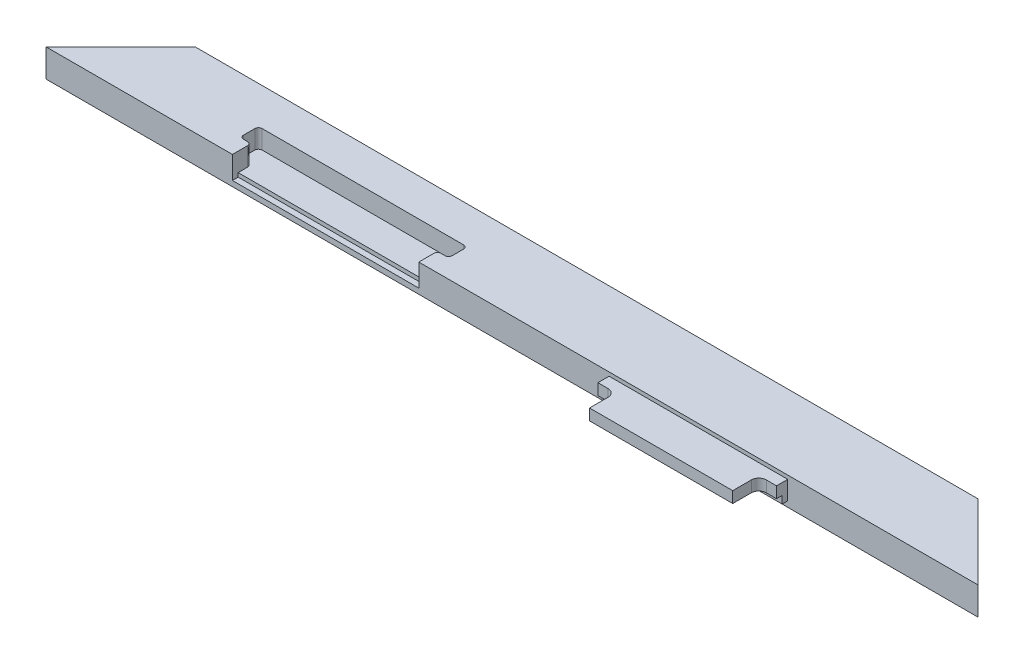
ISO-10303-21;
HEADER;
FILE_DESCRIPTION(('STEP AP214'),'2;1');
FILE_NAME('part.step','',(''),(''),'','','');
FILE_SCHEMA(('AUTOMOTIVE_DESIGN { 1 0 10303 214 1 1 1 1 }'));
ENDSEC;
DATA;
#1=APPLICATION_CONTEXT('core data for automotive mechanical design processes');
#2=APPLICATION_PROTOCOL_DEFINITION('international standard','automotive_design',2000,#1);
#3=PRODUCT_CONTEXT('',#1,'mechanical');
#4=PRODUCT('Part','Part','',(#3));
#5=PRODUCT_RELATED_PRODUCT_CATEGORY('part','',(#4));
#6=PRODUCT_DEFINITION_FORMATION('','',#4);
#7=PRODUCT_DEFINITION_CONTEXT('part definition',#1,'design');
#8=PRODUCT_DEFINITION('design','',#6,#7);
#9=PRODUCT_DEFINITION_SHAPE('','',#8);
#10=(LENGTH_UNIT() NAMED_UNIT(*) SI_UNIT(.MILLI.,.METRE.));
#11=(NAMED_UNIT(*) PLANE_ANGLE_UNIT() SI_UNIT($,.RADIAN.));
#12=(NAMED_UNIT(*) SI_UNIT($,.STERADIAN.) SOLID_ANGLE_UNIT());
#13=UNCERTAINTY_MEASURE_WITH_UNIT(LENGTH_MEASURE(1.E-05),#10,'distance_accuracy_value','');
#14=(GEOMETRIC_REPRESENTATION_CONTEXT(3) GLOBAL_UNCERTAINTY_ASSIGNED_CONTEXT((#13)) GLOBAL_UNIT_ASSIGNED_CONTEXT((#10,
#11,#12)) REPRESENTATION_CONTEXT('',''));
#15=CARTESIAN_POINT('',(0.,0.,0.));
#16=DIRECTION('',(0.,0.,1.));
#17=DIRECTION('',(1.,0.,0.));
#18=AXIS2_PLACEMENT_3D('',#15,#16,#17);
#19=CARTESIAN_POINT('',(-125.,3.75,10.));
#20=DIRECTION('',(0.,0.,-1.));
#21=DIRECTION('',(-1.,0.,0.));
#22=AXIS2_PLACEMENT_3D('',#19,#20,#21);
#23=PLANE('',#22);
#24=DIRECTION('',(1.,0.,0.));
#25=VECTOR('',#24,1.);
#26=CARTESIAN_POINT('',(26.0437500000001,-2.25,10.));
#27=LINE('',#26,#25);
#28=CARTESIAN_POINT('',(26.0437500000001,-2.25,10.));
#29=VERTEX_POINT('',#28);
#30=CARTESIAN_POINT('',(73.9562500000001,-2.25,10.));
#31=VERTEX_POINT('',#30);
#32=EDGE_CURVE('E333',#29,#31,#27,.T.);
#33=ORIENTED_EDGE('',*,*,#32,.F.);
#34=DIRECTION('',(0.,1.,0.));
#35=VECTOR('',#34,1.);
#36=CARTESIAN_POINT('',(26.0437500000001,-0.25,10.));
#37=LINE('',#36,#35);
#38=CARTESIAN_POINT('',(26.0437500000001,2.75,10.));
#39=VERTEX_POINT('',#38);
#40=EDGE_CURVE('E368',#29,#39,#37,.T.);
#41=ORIENTED_EDGE('',*,*,#40,.T.);
#42=DIRECTION('',(-1.,0.,0.));
#43=VECTOR('',#42,1.);
#44=CARTESIAN_POINT('',(73.9562500000001,2.75,10.));
#45=LINE('',#44,#43);
#46=CARTESIAN_POINT('',(73.9562500000001,2.75,10.));
#47=VERTEX_POINT('',#46);
#48=EDGE_CURVE('E348',#47,#39,#45,.T.);
#49=ORIENTED_EDGE('',*,*,#48,.F.);
#50=DIRECTION('',(0.,1.,0.));
#51=VECTOR('',#50,1.);
#52=CARTESIAN_POINT('',(73.9562500000001,-0.25,10.));
#53=LINE('',#52,#51);
#54=EDGE_CURVE('E388',#31,#47,#53,.T.);
#55=ORIENTED_EDGE('',*,*,#54,.F.);
#56=EDGE_LOOP('',(#33,#41,#49,#55));
#57=FACE_BOUND('',#56,.T.);
#58=DIRECTION('',(0.,-1.,0.));
#59=VECTOR('',#58,1.);
#60=CARTESIAN_POINT('',(-24.9999999999999,3.75,9.99999999999999));
#61=LINE('',#60,#59);
#62=CARTESIAN_POINT('',(-24.9999999999999,3.75,9.99999999999999));
#63=VERTEX_POINT('',#62);
#64=CARTESIAN_POINT('',(-24.9999999999999,-2.3,9.99999999999999));
#65=VERTEX_POINT('',#64);
#66=EDGE_CURVE('E325',#63,#65,#61,.T.);
#67=ORIENTED_EDGE('',*,*,#66,.T.);
#68=DIRECTION('',(-1.,0.,0.));
#69=VECTOR('',#68,1.);
#70=CARTESIAN_POINT('',(-24.9999999999999,-2.3,9.99999999999999));
#71=LINE('',#70,#69);
#72=CARTESIAN_POINT('',(-74.9999999999999,-2.3,9.99999999999999));
#73=VERTEX_POINT('',#72);
#74=EDGE_CURVE('E267',#65,#73,#71,.T.);
#75=ORIENTED_EDGE('',*,*,#74,.T.);
#76=DIRECTION('',(0.,-1.,0.));
#77=VECTOR('',#76,1.);
#78=CARTESIAN_POINT('',(-74.9999999999999,3.75,9.99999999999999));
#79=LINE('',#78,#77);
#80=CARTESIAN_POINT('',(-74.9999999999999,3.75,9.99999999999999));
#81=VERTEX_POINT('',#80);
#82=EDGE_CURVE('E326',#81,#73,#79,.T.);
#83=ORIENTED_EDGE('',*,*,#82,.F.);
#84=DIRECTION('',(1.,0.,0.));
#85=VECTOR('',#84,1.);
#86=CARTESIAN_POINT('',(-125.,3.75,10.));
#87=LINE('',#86,#85);
#88=CARTESIAN_POINT('',(-125.,3.75,10.));
#89=VERTEX_POINT('',#88);
#90=EDGE_CURVE('E409',#89,#81,#87,.T.);
#91=ORIENTED_EDGE('',*,*,#90,.F.);
#92=DIRECTION('',(0.,-1.,0.));
#93=VECTOR('',#92,1.);
#94=CARTESIAN_POINT('',(-125.,3.75,10.));
#95=LINE('',#94,#93);
#96=CARTESIAN_POINT('',(-125.,-3.75,10.));
#97=VERTEX_POINT('',#96);
#98=EDGE_CURVE('E428',#89,#97,#95,.T.);
#99=ORIENTED_EDGE('',*,*,#98,.T.);
#100=DIRECTION('',(1.,0.,0.));
#101=VECTOR('',#100,1.);
#102=CARTESIAN_POINT('',(-125.,-3.75,10.));
#103=LINE('',#102,#101);
#104=CARTESIAN_POINT('',(125.,-3.75,10.));
#105=VERTEX_POINT('',#104);
#106=EDGE_CURVE('E418',#97,#105,#103,.T.);
#107=ORIENTED_EDGE('',*,*,#106,.T.);
#108=DIRECTION('',(0.,-1.,0.));
#109=VECTOR('',#108,1.);
#110=CARTESIAN_POINT('',(125.,3.75,10.));
#111=LINE('',#110,#109);
#112=CARTESIAN_POINT('',(125.,3.75,10.));
#113=VERTEX_POINT('',#112);
#114=EDGE_CURVE('E425',#113,#105,#111,.T.);
#115=ORIENTED_EDGE('',*,*,#114,.F.);
#116=EDGE_CURVE('E407',#63,#113,#87,.T.);
#117=ORIENTED_EDGE('',*,*,#116,.F.);
#118=EDGE_LOOP('',(#67,#75,#83,#91,#99,#107,#115,#117));
#119=FACE_BOUND('',#118,.T.);
#120=ADVANCED_FACE('F39',(#57,#119),#23,.F.);
#121=CARTESIAN_POINT('',(0.,3.75,0.));
#122=DIRECTION('',(0.,1.,0.));
#123=DIRECTION('',(0.,0.,1.));
#124=AXIS2_PLACEMENT_3D('',#121,#122,#123);
#125=PLANE('',#124);
#126=DIRECTION('',(-1.,0.,0.));
#127=VECTOR('',#126,1.);
#128=CARTESIAN_POINT('',(0.,3.75,5.));
#129=LINE('',#128,#127);
#130=CARTESIAN_POINT('',(-22.9999999999999,3.75,5.));
#131=VERTEX_POINT('',#130);
#132=CARTESIAN_POINT('',(-23.9999999999999,3.75,5.));
#133=VERTEX_POINT('',#132);
#134=EDGE_CURVE('E312',#131,#133,#129,.T.);
#135=ORIENTED_EDGE('',*,*,#134,.T.);
#136=CARTESIAN_POINT('',(-23.9999999999999,3.75,6.));
#137=DIRECTION('',(0.,1.,0.));
#138=DIRECTION('',(0.,0.,1.));
#139=AXIS2_PLACEMENT_3D('',#136,#137,#138);
#140=CIRCLE('',#139,1.);
#141=CARTESIAN_POINT('',(-24.9999999999999,3.75,6.));
#142=VERTEX_POINT('',#141);
#143=EDGE_CURVE('E476',#133,#142,#140,.T.);
#144=ORIENTED_EDGE('',*,*,#143,.T.);
#145=DIRECTION('',(0.,0.,1.));
#146=VECTOR('',#145,1.);
#147=CARTESIAN_POINT('',(-24.9999999999999,3.75,0.));
#148=LINE('',#147,#146);
#149=EDGE_CURVE('E315',#142,#63,#148,.T.);
#150=ORIENTED_EDGE('',*,*,#149,.T.);
#151=ORIENTED_EDGE('',*,*,#116,.T.);
#152=DIRECTION('',(-0.707106781186552,0.,-0.707106781186544));
#153=VECTOR('',#152,1.);
#154=CARTESIAN_POINT('',(125.,3.75,10.));
#155=LINE('',#154,#153);
#156=CARTESIAN_POINT('',(105.,3.75,-10.));
#157=VERTEX_POINT('',#156);
#158=EDGE_CURVE('E412',#113,#157,#155,.T.);
#159=ORIENTED_EDGE('',*,*,#158,.T.);
#160=DIRECTION('',(-1.,0.,0.));
#161=VECTOR('',#160,1.);
#162=CARTESIAN_POINT('',(-105.,3.75,-10.));
#163=LINE('',#162,#161);
#164=CARTESIAN_POINT('',(-105.,3.75,-10.));
#165=VERTEX_POINT('',#164);
#166=EDGE_CURVE('E414',#157,#165,#163,.T.);
#167=ORIENTED_EDGE('',*,*,#166,.T.);
#168=DIRECTION('',(-0.707106781186546,0.,0.707106781186549));
#169=VECTOR('',#168,1.);
#170=CARTESIAN_POINT('',(-125.,3.75,10.));
#171=LINE('',#170,#169);
#172=EDGE_CURVE('E404',#165,#89,#171,.T.);
#173=ORIENTED_EDGE('',*,*,#172,.T.);
#174=ORIENTED_EDGE('',*,*,#90,.T.);
#175=DIRECTION('',(0.,0.,1.));
#176=VECTOR('',#175,1.);
#177=CARTESIAN_POINT('',(-74.9999999999999,3.75,0.));
#178=LINE('',#177,#176);
#179=CARTESIAN_POINT('',(-74.9999999999999,3.75,6.));
#180=VERTEX_POINT('',#179);
#181=EDGE_CURVE('E317',#180,#81,#178,.T.);
#182=ORIENTED_EDGE('',*,*,#181,.F.);
#183=CARTESIAN_POINT('',(-75.9999999999999,3.75,6.));
#184=DIRECTION('',(0.,1.,0.));
#185=DIRECTION('',(0.,0.,1.));
#186=AXIS2_PLACEMENT_3D('',#183,#184,#185);
#187=CIRCLE('',#186,1.);
#188=CARTESIAN_POINT('',(-75.9999999999999,3.75,5.));
#189=VERTEX_POINT('',#188);
#190=EDGE_CURVE('E474',#180,#189,#187,.T.);
#191=ORIENTED_EDGE('',*,*,#190,.T.);
#192=DIRECTION('',(1.,0.,0.));
#193=VECTOR('',#192,1.);
#194=CARTESIAN_POINT('',(0.,3.75,5.));
#195=LINE('',#194,#193);
#196=CARTESIAN_POINT('',(-76.9999999999999,3.75,5.));
#197=VERTEX_POINT('',#196);
#198=EDGE_CURVE('E319',#197,#189,#195,.T.);
#199=ORIENTED_EDGE('',*,*,#198,.F.);
#200=CARTESIAN_POINT('',(-76.9999999999999,3.75,4.));
#201=DIRECTION('',(0.,1.,0.));
#202=DIRECTION('',(0.,0.,1.));
#203=AXIS2_PLACEMENT_3D('',#200,#201,#202);
#204=CIRCLE('',#203,1.);
#205=CARTESIAN_POINT('',(-77.9999999999999,3.75,4.));
#206=VERTEX_POINT('',#205);
#207=EDGE_CURVE('E496',#197,#206,#204,.F.);
#208=ORIENTED_EDGE('',*,*,#207,.T.);
#209=DIRECTION('',(0.,0.,1.));
#210=VECTOR('',#209,1.);
#211=CARTESIAN_POINT('',(-77.9999999999999,3.75,0.));
#212=LINE('',#211,#210);
#213=CARTESIAN_POINT('',(-77.9999999999999,3.75,1.00000000000001));
#214=VERTEX_POINT('',#213);
#215=EDGE_CURVE('E322',#214,#206,#212,.T.);
#216=ORIENTED_EDGE('',*,*,#215,.F.);
#217=CARTESIAN_POINT('',(-76.9999999999999,3.75,1.00000000000001));
#218=DIRECTION('',(0.,1.,0.));
#219=DIRECTION('',(0.,0.,1.));
#220=AXIS2_PLACEMENT_3D('',#217,#218,#219);
#221=CIRCLE('',#220,1.);
#222=CARTESIAN_POINT('',(-76.9999999999999,3.75,0.));
#223=VERTEX_POINT('',#222);
#224=EDGE_CURVE('E498',#214,#223,#221,.F.);
#225=ORIENTED_EDGE('',*,*,#224,.T.);
#226=DIRECTION('',(-1.,0.,0.));
#227=VECTOR('',#226,1.);
#228=CARTESIAN_POINT('',(0.,3.75,0.));
#229=LINE('',#228,#227);
#230=CARTESIAN_POINT('',(-22.9999999999999,3.75,0.));
#231=VERTEX_POINT('',#230);
#232=EDGE_CURVE('E306',#231,#223,#229,.T.);
#233=ORIENTED_EDGE('',*,*,#232,.F.);
#234=CARTESIAN_POINT('',(-22.9999999999999,3.75,1.));
#235=DIRECTION('',(0.,1.,0.));
#236=DIRECTION('',(0.,0.,1.));
#237=AXIS2_PLACEMENT_3D('',#234,#235,#236);
#238=CIRCLE('',#237,1.);
#239=CARTESIAN_POINT('',(-21.9999999999999,3.75,1.));
#240=VERTEX_POINT('',#239);
#241=EDGE_CURVE('E490',#231,#240,#238,.F.);
#242=ORIENTED_EDGE('',*,*,#241,.T.);
#243=DIRECTION('',(0.,0.,1.));
#244=VECTOR('',#243,1.);
#245=CARTESIAN_POINT('',(-21.9999999999999,3.75,0.));
#246=LINE('',#245,#244);
#247=CARTESIAN_POINT('',(-21.9999999999999,3.75,4.));
#248=VERTEX_POINT('',#247);
#249=EDGE_CURVE('E309',#240,#248,#246,.T.);
#250=ORIENTED_EDGE('',*,*,#249,.T.);
#251=CARTESIAN_POINT('',(-22.9999999999999,3.75,4.));
#252=DIRECTION('',(0.,1.,0.));
#253=DIRECTION('',(0.,0.,1.));
#254=AXIS2_PLACEMENT_3D('',#251,#252,#253);
#255=CIRCLE('',#254,1.);
#256=EDGE_CURVE('E492',#248,#131,#255,.F.);
#257=ORIENTED_EDGE('',*,*,#256,.T.);
#258=EDGE_LOOP('',(#135,#144,#150,#151,#159,#167,#173,#174,#182,#191,#199,#208,#216,#225,#233,
#242,#250,#257));
#259=FACE_BOUND('',#258,.T.);
#260=ADVANCED_FACE('F517',(#259),#125,.T.);
#261=CARTESIAN_POINT('',(0.,-0.25,0.));
#262=DIRECTION('',(0.,1.,0.));
#263=DIRECTION('',(0.,0.,1.));
#264=AXIS2_PLACEMENT_3D('',#261,#262,#263);
#265=PLANE('',#264);
#266=DIRECTION('',(-1.,0.,0.));
#267=VECTOR('',#266,1.);
#268=CARTESIAN_POINT('',(26.0437500000001,-0.25,11.5));
#269=LINE('',#268,#267);
#270=CARTESIAN_POINT('',(73.9562500000001,-0.25,11.5));
#271=VERTEX_POINT('',#270);
#272=CARTESIAN_POINT('',(26.0437500000001,-0.25,11.5));
#273=VERTEX_POINT('',#272);
#274=EDGE_CURVE('E328',#271,#273,#269,.T.);
#275=ORIENTED_EDGE('',*,*,#274,.F.);
#276=DIRECTION('',(0.,0.,-1.));
#277=VECTOR('',#276,1.);
#278=CARTESIAN_POINT('',(73.9562500000001,-0.25,10.));
#279=LINE('',#278,#277);
#280=CARTESIAN_POINT('',(73.9562500000001,-0.25,13.));
#281=VERTEX_POINT('',#280);
#282=EDGE_CURVE('E365',#281,#271,#279,.T.);
#283=ORIENTED_EDGE('',*,*,#282,.F.);
#284=DIRECTION('',(1.,0.,0.));
#285=VECTOR('',#284,1.);
#286=CARTESIAN_POINT('',(73.9562500000001,-0.25,13.));
#287=LINE('',#286,#285);
#288=CARTESIAN_POINT('',(71.2062500000001,-0.25,13.));
#289=VERTEX_POINT('',#288);
#290=EDGE_CURVE('E363',#289,#281,#287,.T.);
#291=ORIENTED_EDGE('',*,*,#290,.F.);
#292=CARTESIAN_POINT('',(71.2062500000001,-0.25,15.));
#293=DIRECTION('',(0.,1.,0.));
#294=DIRECTION('',(0.,0.,1.));
#295=AXIS2_PLACEMENT_3D('',#292,#293,#294);
#296=CIRCLE('',#295,2.);
#297=CARTESIAN_POINT('',(69.2062500000001,-0.25,15.));
#298=VERTEX_POINT('',#297);
#299=EDGE_CURVE('E447',#289,#298,#296,.T.);
#300=ORIENTED_EDGE('',*,*,#299,.T.);
#301=DIRECTION('',(0.,0.,-1.));
#302=VECTOR('',#301,1.);
#303=CARTESIAN_POINT('',(69.2062500000001,-0.25,13.));
#304=LINE('',#303,#302);
#305=CARTESIAN_POINT('',(69.2062500000001,-0.25,20.));
#306=VERTEX_POINT('',#305);
#307=EDGE_CURVE('E360',#306,#298,#304,.T.);
#308=ORIENTED_EDGE('',*,*,#307,.F.);
#309=DIRECTION('',(1.,0.,0.));
#310=VECTOR('',#309,1.);
#311=CARTESIAN_POINT('',(69.2062500000001,-0.25,20.));
#312=LINE('',#311,#310);
#313=CARTESIAN_POINT('',(30.7937500000001,-0.25,20.));
#314=VERTEX_POINT('',#313);
#315=EDGE_CURVE('E357',#314,#306,#312,.T.);
#316=ORIENTED_EDGE('',*,*,#315,.F.);
#317=DIRECTION('',(0.,0.,1.));
#318=VECTOR('',#317,1.);
#319=CARTESIAN_POINT('',(30.7937500000001,-0.25,13.));
#320=LINE('',#319,#318);
#321=CARTESIAN_POINT('',(30.7937500000001,-0.25,15.));
#322=VERTEX_POINT('',#321);
#323=EDGE_CURVE('E355',#322,#314,#320,.T.);
#324=ORIENTED_EDGE('',*,*,#323,.F.);
#325=CARTESIAN_POINT('',(28.7937500000001,-0.25,15.));
#326=DIRECTION('',(0.,1.,0.));
#327=DIRECTION('',(0.,0.,1.));
#328=AXIS2_PLACEMENT_3D('',#325,#326,#327);
#329=CIRCLE('',#328,2.);
#330=CARTESIAN_POINT('',(28.7937500000001,-0.25,13.));
#331=VERTEX_POINT('',#330);
#332=EDGE_CURVE('E443',#322,#331,#329,.T.);
#333=ORIENTED_EDGE('',*,*,#332,.T.);
#334=DIRECTION('',(1.,0.,0.));
#335=VECTOR('',#334,1.);
#336=CARTESIAN_POINT('',(26.0437500000001,-0.25,13.));
#337=LINE('',#336,#335);
#338=CARTESIAN_POINT('',(26.0437500000001,-0.25,13.));
#339=VERTEX_POINT('',#338);
#340=EDGE_CURVE('E351',#339,#331,#337,.T.);
#341=ORIENTED_EDGE('',*,*,#340,.F.);
#342=DIRECTION('',(0.,0.,1.));
#343=VECTOR('',#342,1.);
#344=CARTESIAN_POINT('',(26.0437500000001,-0.25,10.));
#345=LINE('',#344,#343);
#346=EDGE_CURVE('E349',#273,#339,#345,.T.);
#347=ORIENTED_EDGE('',*,*,#346,.F.);
#348=EDGE_LOOP('',(#275,#283,#291,#300,#308,#316,#324,#333,#341,#347));
#349=FACE_BOUND('',#348,.T.);
#350=ADVANCED_FACE('F537',(#349),#265,.F.);
#351=CARTESIAN_POINT('',(-125.,3.75,10.));
#352=DIRECTION('',(0.707106781186549,0.,0.707106781186546));
#353=DIRECTION('',(0.707106781186546,0.,-0.707106781186549));
#354=AXIS2_PLACEMENT_3D('',#351,#352,#353);
#355=PLANE('',#354);
#356=DIRECTION('',(0.,-1.,0.));
#357=VECTOR('',#356,1.);
#358=CARTESIAN_POINT('',(-105.,3.75,-10.));
#359=LINE('',#358,#357);
#360=CARTESIAN_POINT('',(-105.,1.25,-10.));
#361=VERTEX_POINT('',#360);
#362=EDGE_CURVE('E416',#165,#361,#359,.T.);
#363=ORIENTED_EDGE('',*,*,#362,.T.);
#364=DIRECTION('',(0.577350269189625,0.577350269189625,-0.577350269189628));
#365=VECTOR('',#364,1.);
#366=CARTESIAN_POINT('',(-105.,1.25,-10.));
#367=LINE('',#366,#365);
#368=CARTESIAN_POINT('',(-110.,-3.75,-4.99999999999997));
#369=VERTEX_POINT('',#368);
#370=EDGE_CURVE('E61',#361,#369,#367,.F.);
#371=ORIENTED_EDGE('',*,*,#370,.T.);
#372=DIRECTION('',(-0.707106781186546,0.,0.707106781186549));
#373=VECTOR('',#372,1.);
#374=CARTESIAN_POINT('',(-125.,-3.75,10.));
#375=LINE('',#374,#373);
#376=EDGE_CURVE('E391',#369,#97,#375,.T.);
#377=ORIENTED_EDGE('',*,*,#376,.T.);
#378=ORIENTED_EDGE('',*,*,#98,.F.);
#379=ORIENTED_EDGE('',*,*,#172,.F.);
#380=EDGE_LOOP('',(#363,#371,#377,#378,#379));
#381=FACE_BOUND('',#380,.T.);
#382=ADVANCED_FACE('F514',(#381),#355,.F.);
#383=CARTESIAN_POINT('',(125.,3.75,10.));
#384=DIRECTION('',(-0.707106781186544,0.,0.707106781186552));
#385=DIRECTION('',(0.707106781186552,0.,0.707106781186544));
#386=AXIS2_PLACEMENT_3D('',#383,#384,#385);
#387=PLANE('',#386);
#388=DIRECTION('',(-0.707106781186552,0.,-0.707106781186544));
#389=VECTOR('',#388,1.);
#390=CARTESIAN_POINT('',(125.,-3.75,10.));
#391=LINE('',#390,#389);
#392=CARTESIAN_POINT('',(110.,-3.75,-4.99999999999997));
#393=VERTEX_POINT('',#392);
#394=EDGE_CURVE('E408',#105,#393,#391,.T.);
#395=ORIENTED_EDGE('',*,*,#394,.T.);
#396=DIRECTION('',(0.577350269189631,-0.577350269189622,0.577350269189625));
#397=VECTOR('',#396,1.);
#398=CARTESIAN_POINT('',(34.9999999999986,71.2500000000001,-80.0000000000005));
#399=LINE('',#398,#397);
#400=CARTESIAN_POINT('',(105.,1.25,-10.));
#401=VERTEX_POINT('',#400);
#402=EDGE_CURVE('E11',#393,#401,#399,.F.);
#403=ORIENTED_EDGE('',*,*,#402,.T.);
#404=DIRECTION('',(0.,-1.,0.));
#405=VECTOR('',#404,1.);
#406=CARTESIAN_POINT('',(105.,3.75,-10.));
#407=LINE('',#406,#405);
#408=EDGE_CURVE('E422',#157,#401,#407,.T.);
#409=ORIENTED_EDGE('',*,*,#408,.F.);
#410=ORIENTED_EDGE('',*,*,#158,.F.);
#411=ORIENTED_EDGE('',*,*,#114,.T.);
#412=EDGE_LOOP('',(#395,#403,#409,#410,#411));
#413=FACE_BOUND('',#412,.T.);
#414=ADVANCED_FACE('F523',(#413),#387,.F.);
#415=CARTESIAN_POINT('',(-105.,3.75,-10.));
#416=DIRECTION('',(0.,0.,1.));
#417=DIRECTION('',(1.,0.,0.));
#418=AXIS2_PLACEMENT_3D('',#415,#416,#417);
#419=PLANE('',#418);
#420=ORIENTED_EDGE('',*,*,#408,.T.);
#421=DIRECTION('',(-1.,0.,0.));
#422=VECTOR('',#421,1.);
#423=CARTESIAN_POINT('',(-105.,1.25,-10.));
#424=LINE('',#423,#422);
#425=EDGE_CURVE('E502',#401,#361,#424,.T.);
#426=ORIENTED_EDGE('',*,*,#425,.T.);
#427=ORIENTED_EDGE('',*,*,#362,.F.);
#428=ORIENTED_EDGE('',*,*,#166,.F.);
#429=EDGE_LOOP('',(#420,#426,#427,#428));
#430=FACE_BOUND('',#429,.T.);
#431=ADVANCED_FACE('F508',(#430),#419,.F.);
#432=CARTESIAN_POINT('',(0.,-3.75,0.));
#433=DIRECTION('',(0.,1.,0.));
#434=DIRECTION('',(0.,0.,1.));
#435=AXIS2_PLACEMENT_3D('',#432,#433,#434);
#436=PLANE('',#435);
#437=ORIENTED_EDGE('',*,*,#376,.F.);
#438=DIRECTION('',(1.,0.,0.));
#439=VECTOR('',#438,1.);
#440=CARTESIAN_POINT('',(0.,-3.75,-4.99999999999997));
#441=LINE('',#440,#439);
#442=EDGE_CURVE('E47',#369,#393,#441,.T.);
#443=ORIENTED_EDGE('',*,*,#442,.T.);
#444=ORIENTED_EDGE('',*,*,#394,.F.);
#445=ORIENTED_EDGE('',*,*,#106,.F.);
#446=EDGE_LOOP('',(#437,#443,#444,#445));
#447=FACE_BOUND('',#446,.T.);
#448=ADVANCED_FACE('F601',(#447),#436,.F.);
#449=CARTESIAN_POINT('',(73.9562500000001,-0.25,10.));
#450=DIRECTION('',(1.,0.,0.));
#451=DIRECTION('',(0.,0.,-1.));
#452=AXIS2_PLACEMENT_3D('',#449,#450,#451);
#453=PLANE('',#452);
#454=DIRECTION('',(0.,0.,-1.));
#455=VECTOR('',#454,1.);
#456=CARTESIAN_POINT('',(73.9562500000001,2.75,10.));
#457=LINE('',#456,#455);
#458=CARTESIAN_POINT('',(73.9562500000001,2.75,13.));
#459=VERTEX_POINT('',#458);
#460=EDGE_CURVE('E352',#459,#47,#457,.T.);
#461=ORIENTED_EDGE('',*,*,#460,.F.);
#462=DIRECTION('',(0.,1.,0.));
#463=VECTOR('',#462,1.);
#464=CARTESIAN_POINT('',(73.9562500000001,-0.25,13.));
#465=LINE('',#464,#463);
#466=EDGE_CURVE('E392',#281,#459,#465,.T.);
#467=ORIENTED_EDGE('',*,*,#466,.F.);
#468=ORIENTED_EDGE('',*,*,#282,.T.);
#469=DIRECTION('',(0.,1.,0.));
#470=VECTOR('',#469,1.);
#471=CARTESIAN_POINT('',(73.9562500000001,-2.25,11.5));
#472=LINE('',#471,#470);
#473=CARTESIAN_POINT('',(73.9562500000001,-2.25,11.5));
#474=VERTEX_POINT('',#473);
#475=EDGE_CURVE('E345',#474,#271,#472,.T.);
#476=ORIENTED_EDGE('',*,*,#475,.F.);
#477=DIRECTION('',(0.,0.,1.));
#478=VECTOR('',#477,1.);
#479=CARTESIAN_POINT('',(73.9562500000001,-2.25,10.));
#480=LINE('',#479,#478);
#481=EDGE_CURVE('E336',#31,#474,#480,.T.);
#482=ORIENTED_EDGE('',*,*,#481,.F.);
#483=ORIENTED_EDGE('',*,*,#54,.T.);
#484=EDGE_LOOP('',(#461,#467,#468,#476,#482,#483));
#485=FACE_BOUND('',#484,.T.);
#486=ADVANCED_FACE('F655',(#485),#453,.T.);
#487=CARTESIAN_POINT('',(73.9562500000001,-0.25,13.));
#488=DIRECTION('',(0.,0.,1.));
#489=DIRECTION('',(1.,0.,0.));
#490=AXIS2_PLACEMENT_3D('',#487,#488,#489);
#491=PLANE('',#490);
#492=DIRECTION('',(1.,0.,0.));
#493=VECTOR('',#492,1.);
#494=CARTESIAN_POINT('',(73.9562500000001,2.75,13.));
#495=LINE('',#494,#493);
#496=CARTESIAN_POINT('',(71.2062500000001,2.75,13.));
#497=VERTEX_POINT('',#496);
#498=EDGE_CURVE('E385',#497,#459,#495,.T.);
#499=ORIENTED_EDGE('',*,*,#498,.F.);
#500=DIRECTION('',(0.,1.,0.));
#501=VECTOR('',#500,1.);
#502=CARTESIAN_POINT('',(71.2062500000001,-0.25,13.));
#503=LINE('',#502,#501);
#504=EDGE_CURVE('E439',#497,#289,#503,.F.);
#505=ORIENTED_EDGE('',*,*,#504,.T.);
#506=ORIENTED_EDGE('',*,*,#290,.T.);
#507=ORIENTED_EDGE('',*,*,#466,.T.);
#508=EDGE_LOOP('',(#499,#505,#506,#507));
#509=FACE_BOUND('',#508,.T.);
#510=ADVANCED_FACE('F658',(#509),#491,.T.);
#511=CARTESIAN_POINT('',(69.2062500000001,-0.25,13.));
#512=DIRECTION('',(1.,0.,0.));
#513=DIRECTION('',(0.,0.,-1.));
#514=AXIS2_PLACEMENT_3D('',#511,#512,#513);
#515=PLANE('',#514);
#516=ORIENTED_EDGE('',*,*,#307,.T.);
#517=DIRECTION('',(0.,1.,0.));
#518=VECTOR('',#517,1.);
#519=CARTESIAN_POINT('',(69.2062500000001,2.75,15.));
#520=LINE('',#519,#518);
#521=CARTESIAN_POINT('',(69.2062500000001,2.75,15.));
#522=VERTEX_POINT('',#521);
#523=EDGE_CURVE('E436',#298,#522,#520,.T.);
#524=ORIENTED_EDGE('',*,*,#523,.T.);
#525=DIRECTION('',(0.,0.,-1.));
#526=VECTOR('',#525,1.);
#527=CARTESIAN_POINT('',(69.2062500000001,2.75,13.));
#528=LINE('',#527,#526);
#529=CARTESIAN_POINT('',(69.2062500000001,2.75,20.));
#530=VERTEX_POINT('',#529);
#531=EDGE_CURVE('E382',#530,#522,#528,.T.);
#532=ORIENTED_EDGE('',*,*,#531,.F.);
#533=DIRECTION('',(0.,1.,0.));
#534=VECTOR('',#533,1.);
#535=CARTESIAN_POINT('',(69.2062500000001,-0.25,20.));
#536=LINE('',#535,#534);
#537=EDGE_CURVE('E395',#306,#530,#536,.T.);
#538=ORIENTED_EDGE('',*,*,#537,.F.);
#539=EDGE_LOOP('',(#516,#524,#532,#538));
#540=FACE_BOUND('',#539,.T.);
#541=ADVANCED_FACE('F662',(#540),#515,.T.);
#542=CARTESIAN_POINT('',(69.2062500000001,-0.25,20.));
#543=DIRECTION('',(0.,0.,1.));
#544=DIRECTION('',(1.,0.,0.));
#545=AXIS2_PLACEMENT_3D('',#542,#543,#544);
#546=PLANE('',#545);
#547=DIRECTION('',(1.,0.,0.));
#548=VECTOR('',#547,1.);
#549=CARTESIAN_POINT('',(69.2062500000001,2.75,20.));
#550=LINE('',#549,#548);
#551=CARTESIAN_POINT('',(30.7937500000001,2.75,20.));
#552=VERTEX_POINT('',#551);
#553=EDGE_CURVE('E379',#552,#530,#550,.T.);
#554=ORIENTED_EDGE('',*,*,#553,.F.);
#555=DIRECTION('',(0.,1.,0.));
#556=VECTOR('',#555,1.);
#557=CARTESIAN_POINT('',(30.7937500000001,-0.25,20.));
#558=LINE('',#557,#556);
#559=EDGE_CURVE('E397',#314,#552,#558,.T.);
#560=ORIENTED_EDGE('',*,*,#559,.F.);
#561=ORIENTED_EDGE('',*,*,#315,.T.);
#562=ORIENTED_EDGE('',*,*,#537,.T.);
#563=EDGE_LOOP('',(#554,#560,#561,#562));
#564=FACE_BOUND('',#563,.T.);
#565=ADVANCED_FACE('F666',(#564),#546,.T.);
#566=CARTESIAN_POINT('',(30.7937500000001,-0.25,13.));
#567=DIRECTION('',(-1.,0.,0.));
#568=DIRECTION('',(0.,0.,1.));
#569=AXIS2_PLACEMENT_3D('',#566,#567,#568);
#570=PLANE('',#569);
#571=DIRECTION('',(0.,0.,1.));
#572=VECTOR('',#571,1.);
#573=CARTESIAN_POINT('',(30.7937500000001,2.75,13.));
#574=LINE('',#573,#572);
#575=CARTESIAN_POINT('',(30.7937500000001,2.75,15.));
#576=VERTEX_POINT('',#575);
#577=EDGE_CURVE('E377',#576,#552,#574,.T.);
#578=ORIENTED_EDGE('',*,*,#577,.F.);
#579=DIRECTION('',(0.,1.,0.));
#580=VECTOR('',#579,1.);
#581=CARTESIAN_POINT('',(30.7937500000001,-0.25,15.));
#582=LINE('',#581,#580);
#583=EDGE_CURVE('E434',#576,#322,#582,.F.);
#584=ORIENTED_EDGE('',*,*,#583,.T.);
#585=ORIENTED_EDGE('',*,*,#323,.T.);
#586=ORIENTED_EDGE('',*,*,#559,.T.);
#587=EDGE_LOOP('',(#578,#584,#585,#586));
#588=FACE_BOUND('',#587,.T.);
#589=ADVANCED_FACE('F670',(#588),#570,.T.);
#590=CARTESIAN_POINT('',(26.0437500000001,-0.25,13.));
#591=DIRECTION('',(0.,0.,1.));
#592=DIRECTION('',(1.,0.,0.));
#593=AXIS2_PLACEMENT_3D('',#590,#591,#592);
#594=PLANE('',#593);
#595=ORIENTED_EDGE('',*,*,#340,.T.);
#596=DIRECTION('',(0.,1.,0.));
#597=VECTOR('',#596,1.);
#598=CARTESIAN_POINT('',(28.7937500000001,2.75,13.));
#599=LINE('',#598,#597);
#600=CARTESIAN_POINT('',(28.7937500000001,2.75,13.));
#601=VERTEX_POINT('',#600);
#602=EDGE_CURVE('E431',#331,#601,#599,.T.);
#603=ORIENTED_EDGE('',*,*,#602,.T.);
#604=DIRECTION('',(1.,0.,0.));
#605=VECTOR('',#604,1.);
#606=CARTESIAN_POINT('',(26.0437500000001,2.75,13.));
#607=LINE('',#606,#605);
#608=CARTESIAN_POINT('',(26.0437500000001,2.75,13.));
#609=VERTEX_POINT('',#608);
#610=EDGE_CURVE('E374',#609,#601,#607,.T.);
#611=ORIENTED_EDGE('',*,*,#610,.F.);
#612=DIRECTION('',(0.,1.,0.));
#613=VECTOR('',#612,1.);
#614=CARTESIAN_POINT('',(26.0437500000001,-0.25,13.));
#615=LINE('',#614,#613);
#616=EDGE_CURVE('E400',#339,#609,#615,.T.);
#617=ORIENTED_EDGE('',*,*,#616,.F.);
#618=EDGE_LOOP('',(#595,#603,#611,#617));
#619=FACE_BOUND('',#618,.T.);
#620=ADVANCED_FACE('F674',(#619),#594,.T.);
#621=CARTESIAN_POINT('',(26.0437500000001,-0.25,10.));
#622=DIRECTION('',(-1.,0.,0.));
#623=DIRECTION('',(0.,0.,1.));
#624=AXIS2_PLACEMENT_3D('',#621,#622,#623);
#625=PLANE('',#624);
#626=DIRECTION('',(0.,0.,1.));
#627=VECTOR('',#626,1.);
#628=CARTESIAN_POINT('',(26.0437500000001,2.75,10.));
#629=LINE('',#628,#627);
#630=EDGE_CURVE('E371',#39,#609,#629,.T.);
#631=ORIENTED_EDGE('',*,*,#630,.F.);
#632=ORIENTED_EDGE('',*,*,#40,.F.);
#633=DIRECTION('',(0.,0.,-1.));
#634=VECTOR('',#633,1.);
#635=CARTESIAN_POINT('',(26.0437500000001,-2.25,10.));
#636=LINE('',#635,#634);
#637=CARTESIAN_POINT('',(26.0437500000001,-2.25,11.5));
#638=VERTEX_POINT('',#637);
#639=EDGE_CURVE('E330',#638,#29,#636,.T.);
#640=ORIENTED_EDGE('',*,*,#639,.F.);
#641=DIRECTION('',(0.,1.,0.));
#642=VECTOR('',#641,1.);
#643=CARTESIAN_POINT('',(26.0437500000001,-2.25,11.5));
#644=LINE('',#643,#642);
#645=EDGE_CURVE('E340',#638,#273,#644,.T.);
#646=ORIENTED_EDGE('',*,*,#645,.T.);
#647=ORIENTED_EDGE('',*,*,#346,.T.);
#648=ORIENTED_EDGE('',*,*,#616,.T.);
#649=EDGE_LOOP('',(#631,#632,#640,#646,#647,#648));
#650=FACE_BOUND('',#649,.T.);
#651=ADVANCED_FACE('F653',(#650),#625,.T.);
#652=CARTESIAN_POINT('',(0.,2.75,0.));
#653=DIRECTION('',(0.,1.,0.));
#654=DIRECTION('',(0.,0.,1.));
#655=AXIS2_PLACEMENT_3D('',#652,#653,#654);
#656=PLANE('',#655);
#657=ORIENTED_EDGE('',*,*,#48,.T.);
#658=ORIENTED_EDGE('',*,*,#630,.T.);
#659=ORIENTED_EDGE('',*,*,#610,.T.);
#660=CARTESIAN_POINT('',(28.7937500000001,2.75,15.));
#661=DIRECTION('',(0.,1.,0.));
#662=DIRECTION('',(0.,0.,1.));
#663=AXIS2_PLACEMENT_3D('',#660,#661,#662);
#664=CIRCLE('',#663,2.);
#665=EDGE_CURVE('E441',#601,#576,#664,.F.);
#666=ORIENTED_EDGE('',*,*,#665,.T.);
#667=ORIENTED_EDGE('',*,*,#577,.T.);
#668=ORIENTED_EDGE('',*,*,#553,.T.);
#669=ORIENTED_EDGE('',*,*,#531,.T.);
#670=CARTESIAN_POINT('',(71.2062500000001,2.75,15.));
#671=DIRECTION('',(0.,1.,0.));
#672=DIRECTION('',(0.,0.,1.));
#673=AXIS2_PLACEMENT_3D('',#670,#671,#672);
#674=CIRCLE('',#673,2.);
#675=EDGE_CURVE('E445',#522,#497,#674,.F.);
#676=ORIENTED_EDGE('',*,*,#675,.T.);
#677=ORIENTED_EDGE('',*,*,#498,.T.);
#678=ORIENTED_EDGE('',*,*,#460,.T.);
#679=EDGE_LOOP('',(#657,#658,#659,#666,#667,#668,#669,#676,#677,#678));
#680=FACE_BOUND('',#679,.T.);
#681=ADVANCED_FACE('F646',(#680),#656,.T.);
#682=CARTESIAN_POINT('',(26.0437500000001,-2.25,11.5));
#683=DIRECTION('',(0.,0.,-1.));
#684=DIRECTION('',(-1.,0.,0.));
#685=AXIS2_PLACEMENT_3D('',#682,#683,#684);
#686=PLANE('',#685);
#687=ORIENTED_EDGE('',*,*,#274,.T.);
#688=ORIENTED_EDGE('',*,*,#645,.F.);
#689=DIRECTION('',(-1.,0.,0.));
#690=VECTOR('',#689,1.);
#691=CARTESIAN_POINT('',(26.0437500000001,-2.25,11.5));
#692=LINE('',#691,#690);
#693=EDGE_CURVE('E338',#474,#638,#692,.T.);
#694=ORIENTED_EDGE('',*,*,#693,.F.);
#695=ORIENTED_EDGE('',*,*,#475,.T.);
#696=EDGE_LOOP('',(#687,#688,#694,#695));
#697=FACE_BOUND('',#696,.T.);
#698=ADVANCED_FACE('F642',(#697),#686,.F.);
#699=CARTESIAN_POINT('',(0.,-2.25,0.));
#700=DIRECTION('',(0.,1.,0.));
#701=DIRECTION('',(0.,0.,1.));
#702=AXIS2_PLACEMENT_3D('',#699,#700,#701);
#703=PLANE('',#702);
#704=ORIENTED_EDGE('',*,*,#639,.T.);
#705=ORIENTED_EDGE('',*,*,#32,.T.);
#706=ORIENTED_EDGE('',*,*,#481,.T.);
#707=ORIENTED_EDGE('',*,*,#693,.T.);
#708=EDGE_LOOP('',(#704,#705,#706,#707));
#709=FACE_BOUND('',#708,.T.);
#710=ADVANCED_FACE('F550',(#709),#703,.F.);
#711=CARTESIAN_POINT('',(28.7937500000001,-0.25,15.));
#712=DIRECTION('',(0.,-1.,0.));
#713=DIRECTION('',(0.,0.,-1.));
#714=AXIS2_PLACEMENT_3D('',#711,#712,#713);
#715=CYLINDRICAL_SURFACE('',#714,2.);
#716=ORIENTED_EDGE('',*,*,#332,.F.);
#717=ORIENTED_EDGE('',*,*,#583,.F.);
#718=ORIENTED_EDGE('',*,*,#665,.F.);
#719=ORIENTED_EDGE('',*,*,#602,.F.);
#720=EDGE_LOOP('',(#716,#717,#718,#719));
#721=FACE_BOUND('',#720,.T.);
#722=ADVANCED_FACE('F546',(#721),#715,.F.);
#723=CARTESIAN_POINT('',(71.2062500000001,-0.25,15.));
#724=DIRECTION('',(0.,-1.,0.));
#725=DIRECTION('',(0.,0.,-1.));
#726=AXIS2_PLACEMENT_3D('',#723,#724,#725);
#727=CYLINDRICAL_SURFACE('',#726,2.);
#728=ORIENTED_EDGE('',*,*,#299,.F.);
#729=ORIENTED_EDGE('',*,*,#504,.F.);
#730=ORIENTED_EDGE('',*,*,#675,.F.);
#731=ORIENTED_EDGE('',*,*,#523,.F.);
#732=EDGE_LOOP('',(#728,#729,#730,#731));
#733=FACE_BOUND('',#732,.T.);
#734=ADVANCED_FACE('F549',(#733),#727,.F.);
#735=CARTESIAN_POINT('',(0.,3.75,0.));
#736=DIRECTION('',(0.,0.,1.));
#737=DIRECTION('',(1.,0.,0.));
#738=AXIS2_PLACEMENT_3D('',#735,#736,#737);
#739=PLANE('',#738);
#740=DIRECTION('',(-1.,0.,0.));
#741=VECTOR('',#740,1.);
#742=CARTESIAN_POINT('',(0.,-1.25,0.));
#743=LINE('',#742,#741);
#744=CARTESIAN_POINT('',(-22.9999999999999,-1.25,0.));
#745=VERTEX_POINT('',#744);
#746=CARTESIAN_POINT('',(-76.9999999999999,-1.25,0.));
#747=VERTEX_POINT('',#746);
#748=EDGE_CURVE('E287',#745,#747,#743,.T.);
#749=ORIENTED_EDGE('',*,*,#748,.F.);
#750=DIRECTION('',(0.,-1.,0.));
#751=VECTOR('',#750,1.);
#752=CARTESIAN_POINT('',(-22.9999999999999,3.75,0.));
#753=LINE('',#752,#751);
#754=EDGE_CURVE('E465',#745,#231,#753,.F.);
#755=ORIENTED_EDGE('',*,*,#754,.T.);
#756=ORIENTED_EDGE('',*,*,#232,.T.);
#757=DIRECTION('',(0.,-1.,0.));
#758=VECTOR('',#757,1.);
#759=CARTESIAN_POINT('',(-76.9999999999999,-1.25,0.));
#760=LINE('',#759,#758);
#761=EDGE_CURVE('E462',#223,#747,#760,.T.);
#762=ORIENTED_EDGE('',*,*,#761,.T.);
#763=EDGE_LOOP('',(#749,#755,#756,#762));
#764=FACE_BOUND('',#763,.T.);
#765=ADVANCED_FACE('F554',(#764),#739,.T.);
#766=CARTESIAN_POINT('',(-77.9999999999999,3.75,0.));
#767=DIRECTION('',(1.,0.,0.));
#768=DIRECTION('',(0.,0.,-1.));
#769=AXIS2_PLACEMENT_3D('',#766,#767,#768);
#770=PLANE('',#769);
#771=ORIENTED_EDGE('',*,*,#215,.T.);
#772=DIRECTION('',(0.,-1.,0.));
#773=VECTOR('',#772,1.);
#774=CARTESIAN_POINT('',(-77.9999999999999,-1.25,4.));
#775=LINE('',#774,#773);
#776=CARTESIAN_POINT('',(-77.9999999999999,-1.25,4.));
#777=VERTEX_POINT('',#776);
#778=EDGE_CURVE('E480',#206,#777,#775,.T.);
#779=ORIENTED_EDGE('',*,*,#778,.T.);
#780=DIRECTION('',(0.,0.,1.));
#781=VECTOR('',#780,1.);
#782=CARTESIAN_POINT('',(-77.9999999999999,-1.25,0.));
#783=LINE('',#782,#781);
#784=CARTESIAN_POINT('',(-77.9999999999999,-1.25,1.00000000000001));
#785=VERTEX_POINT('',#784);
#786=EDGE_CURVE('E303',#785,#777,#783,.T.);
#787=ORIENTED_EDGE('',*,*,#786,.F.);
#788=DIRECTION('',(0.,-1.,0.));
#789=VECTOR('',#788,1.);
#790=CARTESIAN_POINT('',(-77.9999999999999,3.75,1.00000000000001));
#791=LINE('',#790,#789);
#792=EDGE_CURVE('E478',#785,#214,#791,.F.);
#793=ORIENTED_EDGE('',*,*,#792,.T.);
#794=EDGE_LOOP('',(#771,#779,#787,#793));
#795=FACE_BOUND('',#794,.T.);
#796=ADVANCED_FACE('F620',(#795),#770,.T.);
#797=CARTESIAN_POINT('',(0.,3.75,5.));
#798=DIRECTION('',(0.,0.,-1.));
#799=DIRECTION('',(-1.,0.,0.));
#800=AXIS2_PLACEMENT_3D('',#797,#798,#799);
#801=PLANE('',#800);
#802=DIRECTION('',(1.,0.,0.));
#803=VECTOR('',#802,1.);
#804=CARTESIAN_POINT('',(0.,-1.25,5.));
#805=LINE('',#804,#803);
#806=CARTESIAN_POINT('',(-76.9999999999999,-1.25,5.));
#807=VERTEX_POINT('',#806);
#808=CARTESIAN_POINT('',(-75.9999999999999,-1.25,5.));
#809=VERTEX_POINT('',#808);
#810=EDGE_CURVE('E300',#807,#809,#805,.T.);
#811=ORIENTED_EDGE('',*,*,#810,.F.);
#812=DIRECTION('',(0.,-1.,0.));
#813=VECTOR('',#812,1.);
#814=CARTESIAN_POINT('',(-76.9999999999999,3.75,5.));
#815=LINE('',#814,#813);
#816=EDGE_CURVE('E486',#807,#197,#815,.F.);
#817=ORIENTED_EDGE('',*,*,#816,.T.);
#818=ORIENTED_EDGE('',*,*,#198,.T.);
#819=DIRECTION('',(0.,-1.,0.));
#820=VECTOR('',#819,1.);
#821=CARTESIAN_POINT('',(-75.9999999999999,3.75,5.));
#822=LINE('',#821,#820);
#823=EDGE_CURVE('E483',#189,#809,#822,.T.);
#824=ORIENTED_EDGE('',*,*,#823,.T.);
#825=EDGE_LOOP('',(#811,#817,#818,#824));
#826=FACE_BOUND('',#825,.T.);
#827=ADVANCED_FACE('F612',(#826),#801,.T.);
#828=CARTESIAN_POINT('',(-74.9999999999999,3.75,0.));
#829=DIRECTION('',(1.,0.,0.));
#830=DIRECTION('',(0.,0.,-1.));
#831=AXIS2_PLACEMENT_3D('',#828,#829,#830);
#832=PLANE('',#831);
#833=DIRECTION('',(0.,0.,1.));
#834=VECTOR('',#833,1.);
#835=CARTESIAN_POINT('',(-74.9999999999999,-1.25,0.));
#836=LINE('',#835,#834);
#837=CARTESIAN_POINT('',(-74.9999999999999,-1.25,6.));
#838=VERTEX_POINT('',#837);
#839=CARTESIAN_POINT('',(-74.9999999999999,-1.25,8.45));
#840=VERTEX_POINT('',#839);
#841=EDGE_CURVE('E298',#838,#840,#836,.T.);
#842=ORIENTED_EDGE('',*,*,#841,.F.);
#843=DIRECTION('',(0.,-1.,0.));
#844=VECTOR('',#843,1.);
#845=CARTESIAN_POINT('',(-74.9999999999999,3.75,6.));
#846=LINE('',#845,#844);
#847=EDGE_CURVE('E488',#838,#180,#846,.F.);
#848=ORIENTED_EDGE('',*,*,#847,.T.);
#849=ORIENTED_EDGE('',*,*,#181,.T.);
#850=ORIENTED_EDGE('',*,*,#82,.T.);
#851=DIRECTION('',(0.,0.,-1.));
#852=VECTOR('',#851,1.);
#853=CARTESIAN_POINT('',(-74.9999999999999,-2.3,9.99999999999999));
#854=LINE('',#853,#852);
#855=CARTESIAN_POINT('',(-74.9999999999999,-2.3,8.45));
#856=VERTEX_POINT('',#855);
#857=EDGE_CURVE('E276',#73,#856,#854,.T.);
#858=ORIENTED_EDGE('',*,*,#857,.T.);
#859=DIRECTION('',(0.,1.,0.));
#860=VECTOR('',#859,1.);
#861=CARTESIAN_POINT('',(-74.9999999999999,-2.3,8.45));
#862=LINE('',#861,#860);
#863=EDGE_CURVE('E266',#856,#840,#862,.T.);
#864=ORIENTED_EDGE('',*,*,#863,.T.);
#865=EDGE_LOOP('',(#842,#848,#849,#850,#858,#864));
#866=FACE_BOUND('',#865,.T.);
#867=ADVANCED_FACE('F605',(#866),#832,.T.);
#868=CARTESIAN_POINT('',(-24.9999999999999,3.75,0.));
#869=DIRECTION('',(1.,0.,0.));
#870=DIRECTION('',(0.,0.,-1.));
#871=AXIS2_PLACEMENT_3D('',#868,#869,#870);
#872=PLANE('',#871);
#873=ORIENTED_EDGE('',*,*,#149,.F.);
#874=DIRECTION('',(0.,-1.,0.));
#875=VECTOR('',#874,1.);
#876=CARTESIAN_POINT('',(-24.9999999999999,3.75,6.));
#877=LINE('',#876,#875);
#878=CARTESIAN_POINT('',(-24.9999999999999,-1.25,6.));
#879=VERTEX_POINT('',#878);
#880=EDGE_CURVE('E472',#142,#879,#877,.T.);
#881=ORIENTED_EDGE('',*,*,#880,.T.);
#882=DIRECTION('',(0.,0.,1.));
#883=VECTOR('',#882,1.);
#884=CARTESIAN_POINT('',(-24.9999999999999,-1.25,0.));
#885=LINE('',#884,#883);
#886=CARTESIAN_POINT('',(-24.9999999999999,-1.25,8.45));
#887=VERTEX_POINT('',#886);
#888=EDGE_CURVE('E262',#879,#887,#885,.T.);
#889=ORIENTED_EDGE('',*,*,#888,.T.);
#890=DIRECTION('',(0.,1.,0.));
#891=VECTOR('',#890,1.);
#892=CARTESIAN_POINT('',(-24.9999999999999,-2.3,8.44999999999999));
#893=LINE('',#892,#891);
#894=CARTESIAN_POINT('',(-24.9999999999999,-2.3,8.44999999999999));
#895=VERTEX_POINT('',#894);
#896=EDGE_CURVE('E253',#895,#887,#893,.T.);
#897=ORIENTED_EDGE('',*,*,#896,.F.);
#898=DIRECTION('',(0.,0.,-1.));
#899=VECTOR('',#898,1.);
#900=CARTESIAN_POINT('',(-24.9999999999999,-2.3,9.99999999999999));
#901=LINE('',#900,#899);
#902=EDGE_CURVE('E259',#65,#895,#901,.T.);
#903=ORIENTED_EDGE('',*,*,#902,.F.);
#904=ORIENTED_EDGE('',*,*,#66,.F.);
#905=EDGE_LOOP('',(#873,#881,#889,#897,#903,#904));
#906=FACE_BOUND('',#905,.T.);
#907=ADVANCED_FACE('F256',(#906),#872,.F.);
#908=CARTESIAN_POINT('',(0.,3.75,5.));
#909=DIRECTION('',(0.,0.,1.));
#910=DIRECTION('',(1.,0.,0.));
#911=AXIS2_PLACEMENT_3D('',#908,#909,#910);
#912=PLANE('',#911);
#913=ORIENTED_EDGE('',*,*,#134,.F.);
#914=DIRECTION('',(0.,-1.,0.));
#915=VECTOR('',#914,1.);
#916=CARTESIAN_POINT('',(-22.9999999999999,-1.25,5.));
#917=LINE('',#916,#915);
#918=CARTESIAN_POINT('',(-22.9999999999999,-1.25,5.));
#919=VERTEX_POINT('',#918);
#920=EDGE_CURVE('E469',#131,#919,#917,.T.);
#921=ORIENTED_EDGE('',*,*,#920,.T.);
#922=DIRECTION('',(-1.,0.,0.));
#923=VECTOR('',#922,1.);
#924=CARTESIAN_POINT('',(0.,-1.25,5.));
#925=LINE('',#924,#923);
#926=CARTESIAN_POINT('',(-23.9999999999999,-1.25,5.));
#927=VERTEX_POINT('',#926);
#928=EDGE_CURVE('E294',#919,#927,#925,.T.);
#929=ORIENTED_EDGE('',*,*,#928,.T.);
#930=DIRECTION('',(0.,-1.,0.));
#931=VECTOR('',#930,1.);
#932=CARTESIAN_POINT('',(-23.9999999999999,3.75,5.));
#933=LINE('',#932,#931);
#934=EDGE_CURVE('E467',#927,#133,#933,.F.);
#935=ORIENTED_EDGE('',*,*,#934,.T.);
#936=EDGE_LOOP('',(#913,#921,#929,#935));
#937=FACE_BOUND('',#936,.T.);
#938=ADVANCED_FACE('F596',(#937),#912,.F.);
#939=CARTESIAN_POINT('',(-21.9999999999999,3.75,0.));
#940=DIRECTION('',(1.,0.,0.));
#941=DIRECTION('',(0.,0.,-1.));
#942=AXIS2_PLACEMENT_3D('',#939,#940,#941);
#943=PLANE('',#942);
#944=ORIENTED_EDGE('',*,*,#249,.F.);
#945=DIRECTION('',(0.,-1.,0.));
#946=VECTOR('',#945,1.);
#947=CARTESIAN_POINT('',(-21.9999999999999,3.75,1.));
#948=LINE('',#947,#946);
#949=CARTESIAN_POINT('',(-21.9999999999999,-1.25,1.));
#950=VERTEX_POINT('',#949);
#951=EDGE_CURVE('E451',#240,#950,#948,.T.);
#952=ORIENTED_EDGE('',*,*,#951,.T.);
#953=DIRECTION('',(0.,0.,1.));
#954=VECTOR('',#953,1.);
#955=CARTESIAN_POINT('',(-21.9999999999999,-1.25,0.));
#956=LINE('',#955,#954);
#957=CARTESIAN_POINT('',(-21.9999999999999,-1.25,4.));
#958=VERTEX_POINT('',#957);
#959=EDGE_CURVE('E291',#950,#958,#956,.T.);
#960=ORIENTED_EDGE('',*,*,#959,.T.);
#961=DIRECTION('',(0.,-1.,0.));
#962=VECTOR('',#961,1.);
#963=CARTESIAN_POINT('',(-21.9999999999999,3.75,4.));
#964=LINE('',#963,#962);
#965=EDGE_CURVE('E449',#958,#248,#964,.F.);
#966=ORIENTED_EDGE('',*,*,#965,.T.);
#967=EDGE_LOOP('',(#944,#952,#960,#966));
#968=FACE_BOUND('',#967,.T.);
#969=ADVANCED_FACE('F589',(#968),#943,.F.);
#970=CARTESIAN_POINT('',(0.,-1.25,0.));
#971=DIRECTION('',(0.,-1.,0.));
#972=DIRECTION('',(0.,0.,-1.));
#973=AXIS2_PLACEMENT_3D('',#970,#971,#972);
#974=PLANE('',#973);
#975=ORIENTED_EDGE('',*,*,#959,.F.);
#976=CARTESIAN_POINT('',(-22.9999999999999,-1.25,1.));
#977=DIRECTION('',(0.,-1.,0.));
#978=DIRECTION('',(0.,0.,-1.));
#979=AXIS2_PLACEMENT_3D('',#976,#977,#978);
#980=CIRCLE('',#979,1.);
#981=EDGE_CURVE('E460',#950,#745,#980,.F.);
#982=ORIENTED_EDGE('',*,*,#981,.T.);
#983=ORIENTED_EDGE('',*,*,#748,.T.);
#984=CARTESIAN_POINT('',(-76.9999999999999,-1.25,1.00000000000001));
#985=DIRECTION('',(0.,-1.,0.));
#986=DIRECTION('',(0.,0.,-1.));
#987=AXIS2_PLACEMENT_3D('',#984,#985,#986);
#988=CIRCLE('',#987,1.);
#989=EDGE_CURVE('E454',#747,#785,#988,.F.);
#990=ORIENTED_EDGE('',*,*,#989,.T.);
#991=ORIENTED_EDGE('',*,*,#786,.T.);
#992=CARTESIAN_POINT('',(-76.9999999999999,-1.25,4.));
#993=DIRECTION('',(0.,-1.,0.));
#994=DIRECTION('',(0.,0.,-1.));
#995=AXIS2_PLACEMENT_3D('',#992,#993,#994);
#996=CIRCLE('',#995,1.);
#997=EDGE_CURVE('E456',#777,#807,#996,.F.);
#998=ORIENTED_EDGE('',*,*,#997,.T.);
#999=ORIENTED_EDGE('',*,*,#810,.T.);
#1000=CARTESIAN_POINT('',(-75.9999999999999,-1.25,6.));
#1001=DIRECTION('',(0.,-1.,0.));
#1002=DIRECTION('',(0.,0.,-1.));
#1003=AXIS2_PLACEMENT_3D('',#1000,#1001,#1002);
#1004=CIRCLE('',#1003,1.);
#1005=EDGE_CURVE('E500',#809,#838,#1004,.T.);
#1006=ORIENTED_EDGE('',*,*,#1005,.T.);
#1007=ORIENTED_EDGE('',*,*,#841,.T.);
#1008=DIRECTION('',(-1.,0.,0.));
#1009=VECTOR('',#1008,1.);
#1010=CARTESIAN_POINT('',(-24.9999999999999,-1.25,8.44999999999999));
#1011=LINE('',#1010,#1009);
#1012=EDGE_CURVE('E281',#887,#840,#1011,.T.);
#1013=ORIENTED_EDGE('',*,*,#1012,.F.);
#1014=ORIENTED_EDGE('',*,*,#888,.F.);
#1015=CARTESIAN_POINT('',(-23.9999999999999,-1.25,6.));
#1016=DIRECTION('',(0.,-1.,0.));
#1017=DIRECTION('',(0.,0.,-1.));
#1018=AXIS2_PLACEMENT_3D('',#1015,#1016,#1017);
#1019=CIRCLE('',#1018,1.);
#1020=EDGE_CURVE('E494',#879,#927,#1019,.T.);
#1021=ORIENTED_EDGE('',*,*,#1020,.T.);
#1022=ORIENTED_EDGE('',*,*,#928,.F.);
#1023=CARTESIAN_POINT('',(-22.9999999999999,-1.25,4.));
#1024=DIRECTION('',(0.,-1.,0.));
#1025=DIRECTION('',(0.,0.,-1.));
#1026=AXIS2_PLACEMENT_3D('',#1023,#1024,#1025);
#1027=CIRCLE('',#1026,1.);
#1028=EDGE_CURVE('E458',#919,#958,#1027,.F.);
#1029=ORIENTED_EDGE('',*,*,#1028,.T.);
#1030=EDGE_LOOP('',(#975,#982,#983,#990,#991,#998,#999,#1006,#1007,#1013,#1014,#1021,#1022,#1029));
#1031=FACE_BOUND('',#1030,.T.);
#1032=ADVANCED_FACE('F615',(#1031),#974,.F.);
#1033=CARTESIAN_POINT('',(-24.9999999999999,-2.3,8.44999999999999));
#1034=DIRECTION('',(0.,0.,-1.));
#1035=DIRECTION('',(-1.,0.,0.));
#1036=AXIS2_PLACEMENT_3D('',#1033,#1034,#1035);
#1037=PLANE('',#1036);
#1038=ORIENTED_EDGE('',*,*,#1012,.T.);
#1039=ORIENTED_EDGE('',*,*,#863,.F.);
#1040=DIRECTION('',(-1.,0.,0.));
#1041=VECTOR('',#1040,1.);
#1042=CARTESIAN_POINT('',(-24.9999999999999,-2.3,8.44999999999999));
#1043=LINE('',#1042,#1041);
#1044=EDGE_CURVE('E271',#895,#856,#1043,.T.);
#1045=ORIENTED_EDGE('',*,*,#1044,.F.);
#1046=ORIENTED_EDGE('',*,*,#896,.T.);
#1047=EDGE_LOOP('',(#1038,#1039,#1045,#1046));
#1048=FACE_BOUND('',#1047,.T.);
#1049=ADVANCED_FACE('F272',(#1048),#1037,.F.);
#1050=CARTESIAN_POINT('',(0.,-2.3,0.));
#1051=DIRECTION('',(0.,1.,0.));
#1052=DIRECTION('',(0.,0.,1.));
#1053=AXIS2_PLACEMENT_3D('',#1050,#1051,#1052);
#1054=PLANE('',#1053);
#1055=ORIENTED_EDGE('',*,*,#902,.T.);
#1056=ORIENTED_EDGE('',*,*,#1044,.T.);
#1057=ORIENTED_EDGE('',*,*,#857,.F.);
#1058=ORIENTED_EDGE('',*,*,#74,.F.);
#1059=EDGE_LOOP('',(#1055,#1056,#1057,#1058));
#1060=FACE_BOUND('',#1059,.T.);
#1061=ADVANCED_FACE('F279',(#1060),#1054,.T.);
#1062=CARTESIAN_POINT('',(-22.9999999999999,3.75,1.));
#1063=DIRECTION('',(0.,-1.,0.));
#1064=DIRECTION('',(0.,0.,-1.));
#1065=AXIS2_PLACEMENT_3D('',#1062,#1063,#1064);
#1066=CYLINDRICAL_SURFACE('',#1065,1.);
#1067=ORIENTED_EDGE('',*,*,#241,.F.);
#1068=ORIENTED_EDGE('',*,*,#754,.F.);
#1069=ORIENTED_EDGE('',*,*,#981,.F.);
#1070=ORIENTED_EDGE('',*,*,#951,.F.);
#1071=EDGE_LOOP('',(#1067,#1068,#1069,#1070));
#1072=FACE_BOUND('',#1071,.T.);
#1073=ADVANCED_FACE('F556',(#1072),#1066,.F.);
#1074=CARTESIAN_POINT('',(-22.9999999999999,3.75,4.));
#1075=DIRECTION('',(0.,1.,0.));
#1076=DIRECTION('',(0.,0.,1.));
#1077=AXIS2_PLACEMENT_3D('',#1074,#1075,#1076);
#1078=CYLINDRICAL_SURFACE('',#1077,1.);
#1079=ORIENTED_EDGE('',*,*,#256,.F.);
#1080=ORIENTED_EDGE('',*,*,#965,.F.);
#1081=ORIENTED_EDGE('',*,*,#1028,.F.);
#1082=ORIENTED_EDGE('',*,*,#920,.F.);
#1083=EDGE_LOOP('',(#1079,#1080,#1081,#1082));
#1084=FACE_BOUND('',#1083,.T.);
#1085=ADVANCED_FACE('F559',(#1084),#1078,.F.);
#1086=CARTESIAN_POINT('',(-23.9999999999999,3.75,6.));
#1087=DIRECTION('',(0.,-1.,0.));
#1088=DIRECTION('',(0.,0.,-1.));
#1089=AXIS2_PLACEMENT_3D('',#1086,#1087,#1088);
#1090=CYLINDRICAL_SURFACE('',#1089,1.);
#1091=ORIENTED_EDGE('',*,*,#143,.F.);
#1092=ORIENTED_EDGE('',*,*,#934,.F.);
#1093=ORIENTED_EDGE('',*,*,#1020,.F.);
#1094=ORIENTED_EDGE('',*,*,#880,.F.);
#1095=EDGE_LOOP('',(#1091,#1092,#1093,#1094));
#1096=FACE_BOUND('',#1095,.T.);
#1097=ADVANCED_FACE('F563',(#1096),#1090,.T.);
#1098=CARTESIAN_POINT('',(-76.9999999999999,3.75,4.));
#1099=DIRECTION('',(0.,1.,0.));
#1100=DIRECTION('',(0.,0.,1.));
#1101=AXIS2_PLACEMENT_3D('',#1098,#1099,#1100);
#1102=CYLINDRICAL_SURFACE('',#1101,1.);
#1103=ORIENTED_EDGE('',*,*,#207,.F.);
#1104=ORIENTED_EDGE('',*,*,#816,.F.);
#1105=ORIENTED_EDGE('',*,*,#997,.F.);
#1106=ORIENTED_EDGE('',*,*,#778,.F.);
#1107=EDGE_LOOP('',(#1103,#1104,#1105,#1106));
#1108=FACE_BOUND('',#1107,.T.);
#1109=ADVANCED_FACE('F567',(#1108),#1102,.F.);
#1110=CARTESIAN_POINT('',(-76.9999999999999,3.75,1.00000000000001));
#1111=DIRECTION('',(0.,1.,0.));
#1112=DIRECTION('',(0.,0.,1.));
#1113=AXIS2_PLACEMENT_3D('',#1110,#1111,#1112);
#1114=CYLINDRICAL_SURFACE('',#1113,1.);
#1115=ORIENTED_EDGE('',*,*,#224,.F.);
#1116=ORIENTED_EDGE('',*,*,#792,.F.);
#1117=ORIENTED_EDGE('',*,*,#989,.F.);
#1118=ORIENTED_EDGE('',*,*,#761,.F.);
#1119=EDGE_LOOP('',(#1115,#1116,#1117,#1118));
#1120=FACE_BOUND('',#1119,.T.);
#1121=ADVANCED_FACE('F529',(#1120),#1114,.F.);
#1122=CARTESIAN_POINT('',(-75.9999999999999,3.75,6.));
#1123=DIRECTION('',(0.,-1.,0.));
#1124=DIRECTION('',(0.,0.,-1.));
#1125=AXIS2_PLACEMENT_3D('',#1122,#1123,#1124);
#1126=CYLINDRICAL_SURFACE('',#1125,1.);
#1127=ORIENTED_EDGE('',*,*,#190,.F.);
#1128=ORIENTED_EDGE('',*,*,#847,.F.);
#1129=ORIENTED_EDGE('',*,*,#1005,.F.);
#1130=ORIENTED_EDGE('',*,*,#823,.F.);
#1131=EDGE_LOOP('',(#1127,#1128,#1129,#1130));
#1132=FACE_BOUND('',#1131,.T.);
#1133=ADVANCED_FACE('F525',(#1132),#1126,.T.);
#1134=CARTESIAN_POINT('',(-105.,1.25,-10.));
#1135=DIRECTION('',(0.,0.707106781186549,0.707106781186545));
#1136=DIRECTION('',(-1.,0.,0.));
#1137=AXIS2_PLACEMENT_3D('',#1134,#1135,#1136);
#1138=PLANE('',#1137);
#1139=ORIENTED_EDGE('',*,*,#402,.F.);
#1140=ORIENTED_EDGE('',*,*,#442,.F.);
#1141=ORIENTED_EDGE('',*,*,#370,.F.);
#1142=ORIENTED_EDGE('',*,*,#425,.F.);
#1143=EDGE_LOOP('',(#1139,#1140,#1141,#1142));
#1144=FACE_BOUND('',#1143,.T.);
#1145=ADVANCED_FACE('F41',(#1144),#1138,.F.);
#1146=CLOSED_SHELL('',(#120,#260,#350,#382,#414,#431,#448,#486,#510,#541,#565,#589,#620,#651,
#681,#698,#710,#722,#734,#765,#796,#827,#867,#907,#938,#969,#1032,#1049,#1061,#1073,#1085,#1097,
#1109,#1121,#1133,#1145));
#1147=MANIFOLD_SOLID_BREP('B2',#1146);
#1148=ADVANCED_BREP_SHAPE_REPRESENTATION('',(#18,#1147),#14);
#1149=SHAPE_DEFINITION_REPRESENTATION(#9,#1148);
ENDSEC;
END-ISO-10303-21;
